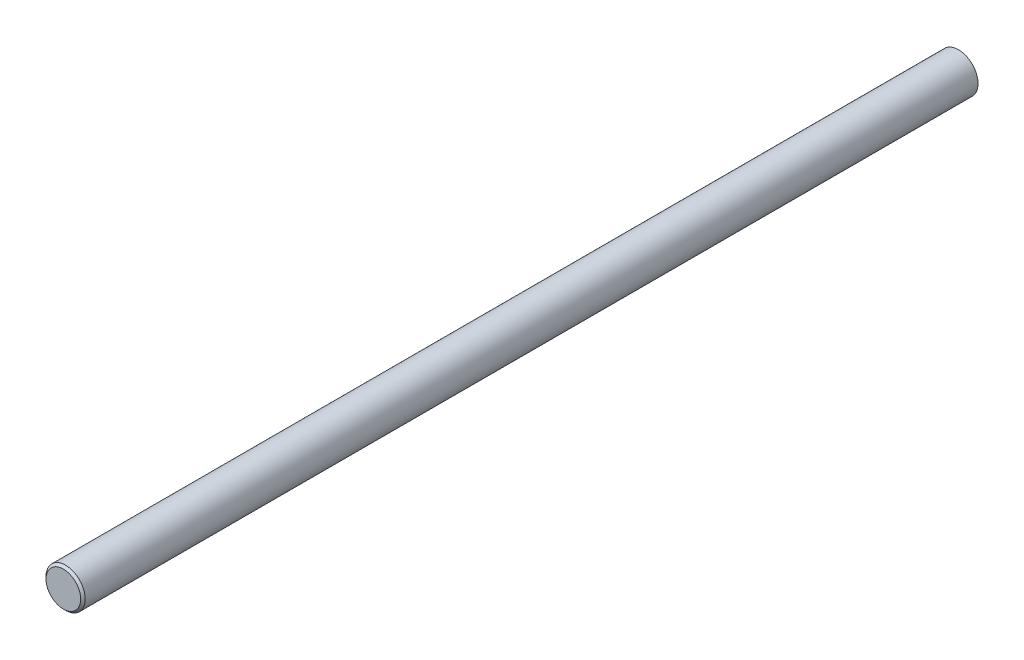
ISO-10303-21;
HEADER;
FILE_DESCRIPTION(('STEP AP214'),'2;1');
FILE_NAME('part.step','',(''),(''),'','','');
FILE_SCHEMA(('AUTOMOTIVE_DESIGN { 1 0 10303 214 1 1 1 1 }'));
ENDSEC;
DATA;
#1=APPLICATION_CONTEXT('core data for automotive mechanical design processes');
#2=APPLICATION_PROTOCOL_DEFINITION('international standard','automotive_design',2000,#1);
#3=PRODUCT_CONTEXT('',#1,'mechanical');
#4=PRODUCT('Part','Part','',(#3));
#5=PRODUCT_RELATED_PRODUCT_CATEGORY('part','',(#4));
#6=PRODUCT_DEFINITION_FORMATION('','',#4);
#7=PRODUCT_DEFINITION_CONTEXT('part definition',#1,'design');
#8=PRODUCT_DEFINITION('design','',#6,#7);
#9=PRODUCT_DEFINITION_SHAPE('','',#8);
#10=(LENGTH_UNIT() NAMED_UNIT(*) SI_UNIT(.MILLI.,.METRE.));
#11=(NAMED_UNIT(*) PLANE_ANGLE_UNIT() SI_UNIT($,.RADIAN.));
#12=(NAMED_UNIT(*) SI_UNIT($,.STERADIAN.) SOLID_ANGLE_UNIT());
#13=UNCERTAINTY_MEASURE_WITH_UNIT(LENGTH_MEASURE(1.E-05),#10,'distance_accuracy_value','');
#14=(GEOMETRIC_REPRESENTATION_CONTEXT(3) GLOBAL_UNCERTAINTY_ASSIGNED_CONTEXT((#13)) GLOBAL_UNIT_ASSIGNED_CONTEXT((#10,
#11,#12)) REPRESENTATION_CONTEXT('',''));
#15=CARTESIAN_POINT('',(0.,0.,0.));
#16=DIRECTION('',(0.,0.,1.));
#17=DIRECTION('',(1.,0.,0.));
#18=AXIS2_PLACEMENT_3D('',#15,#16,#17);
#19=CARTESIAN_POINT('',(0.,0.,80.));
#20=DIRECTION('',(0.,0.,1.));
#21=DIRECTION('',(1.,0.,0.));
#22=AXIS2_PLACEMENT_3D('',#19,#20,#21);
#23=PLANE('',#22);
#24=CARTESIAN_POINT('',(0.,0.,79.9999999999841));
#25=DIRECTION('',(0.,0.,-1.));
#26=DIRECTION('',(-1.,0.,0.));
#27=AXIS2_PLACEMENT_3D('',#24,#25,#26);
#28=CIRCLE('',#27,1.55000000006567);
#29=CARTESIAN_POINT('',(-1.55000000006567,0.,79.9999999999841));
#30=VERTEX_POINT('',#29);
#31=EDGE_CURVE('E18',#30,#30,#28,.T.);
#32=ORIENTED_EDGE('',*,*,#31,.F.);
#33=EDGE_LOOP('',(#32));
#34=FACE_BOUND('',#33,.T.);
#35=ADVANCED_FACE('F15',(#34),#23,.T.);
#36=CARTESIAN_POINT('',(0.,0.,79.8000000000911));
#37=DIRECTION('',(0.,0.,-1.));
#38=DIRECTION('',(-1.,0.,0.));
#39=AXIS2_PLACEMENT_3D('',#36,#37,#38);
#40=CONICAL_SURFACE('',#39,1.74999999990177,0.78539816325534);
#41=CARTESIAN_POINT('',(0.,0.,79.8));
#42=DIRECTION('',(0.,0.,-1.));
#43=DIRECTION('',(-1.,0.,0.));
#44=AXIS2_PLACEMENT_3D('',#41,#42,#43);
#45=CIRCLE('',#44,1.75);
#46=CARTESIAN_POINT('',(-1.75,0.,79.8));
#47=VERTEX_POINT('',#46);
#48=EDGE_CURVE('E22',#47,#47,#45,.T.);
#49=ORIENTED_EDGE('',*,*,#48,.F.);
#50=EDGE_LOOP('',(#49));
#51=FACE_BOUND('',#50,.T.);
#52=ORIENTED_EDGE('',*,*,#31,.T.);
#53=EDGE_LOOP('',(#52));
#54=FACE_BOUND('',#53,.T.);
#55=ADVANCED_FACE('F32',(#51,#54),#40,.T.);
#56=CARTESIAN_POINT('',(0.,0.,0.));
#57=DIRECTION('',(0.,0.,1.));
#58=DIRECTION('',(1.,0.,0.));
#59=AXIS2_PLACEMENT_3D('',#56,#57,#58);
#60=PLANE('',#59);
#61=CARTESIAN_POINT('',(0.,0.,0.));
#62=DIRECTION('',(0.,0.,-1.));
#63=DIRECTION('',(-1.,0.,0.));
#64=AXIS2_PLACEMENT_3D('',#61,#62,#63);
#65=CIRCLE('',#64,1.75);
#66=CARTESIAN_POINT('',(-1.75,0.,0.));
#67=VERTEX_POINT('',#66);
#68=EDGE_CURVE('E10',#67,#67,#65,.F.);
#69=ORIENTED_EDGE('',*,*,#68,.F.);
#70=EDGE_LOOP('',(#69));
#71=FACE_BOUND('',#70,.T.);
#72=ADVANCED_FACE('F39',(#71),#60,.F.);
#73=CARTESIAN_POINT('',(0.,0.,80.));
#74=DIRECTION('',(0.,0.,-1.));
#75=DIRECTION('',(-1.,0.,0.));
#76=AXIS2_PLACEMENT_3D('',#73,#74,#75);
#77=CYLINDRICAL_SURFACE('',#76,1.75);
#78=ORIENTED_EDGE('',*,*,#68,.T.);
#79=EDGE_LOOP('',(#78));
#80=FACE_BOUND('',#79,.T.);
#81=ORIENTED_EDGE('',*,*,#48,.T.);
#82=EDGE_LOOP('',(#81));
#83=FACE_BOUND('',#82,.T.);
#84=ADVANCED_FACE('F41',(#80,#83),#77,.T.);
#85=CLOSED_SHELL('',(#35,#55,#72,#84));
#86=MANIFOLD_SOLID_BREP('B1',#85);
#87=ADVANCED_BREP_SHAPE_REPRESENTATION('',(#18,#86),#14);
#88=SHAPE_DEFINITION_REPRESENTATION(#9,#87);
ENDSEC;
END-ISO-10303-21;
